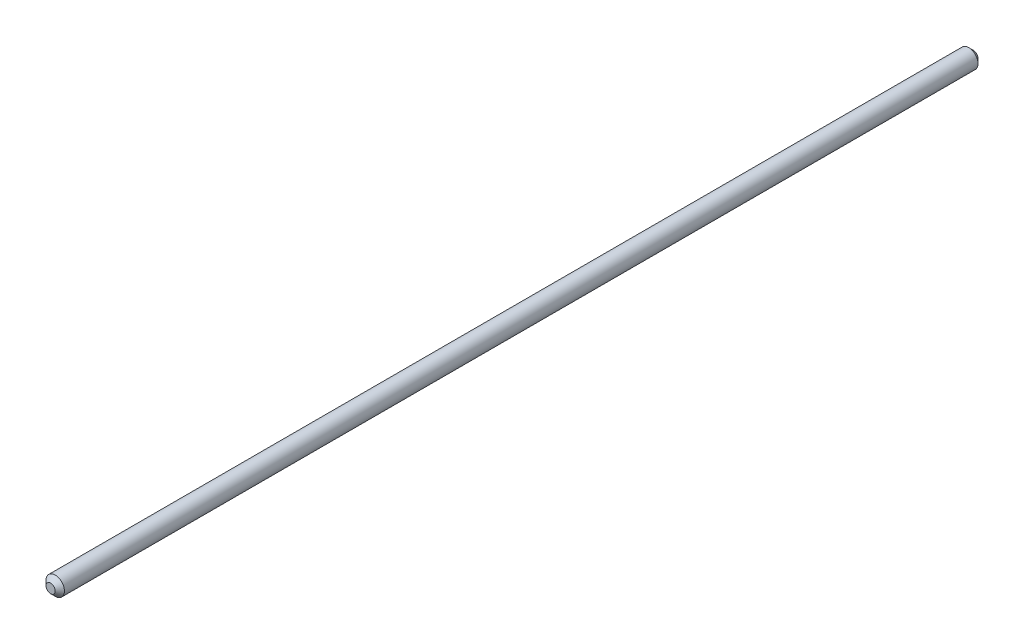
ISO-10303-21;
HEADER;
FILE_DESCRIPTION(('STEP AP214'),'2;1');
FILE_NAME('part.step','',(''),(''),'','','');
FILE_SCHEMA(('AUTOMOTIVE_DESIGN { 1 0 10303 214 1 1 1 1 }'));
ENDSEC;
DATA;
#1=APPLICATION_CONTEXT('core data for automotive mechanical design processes');
#2=APPLICATION_PROTOCOL_DEFINITION('international standard','automotive_design',2000,#1);
#3=PRODUCT_CONTEXT('',#1,'mechanical');
#4=PRODUCT('Part','Part','',(#3));
#5=PRODUCT_RELATED_PRODUCT_CATEGORY('part','',(#4));
#6=PRODUCT_DEFINITION_FORMATION('','',#4);
#7=PRODUCT_DEFINITION_CONTEXT('part definition',#1,'design');
#8=PRODUCT_DEFINITION('design','',#6,#7);
#9=PRODUCT_DEFINITION_SHAPE('','',#8);
#10=(LENGTH_UNIT() NAMED_UNIT(*) SI_UNIT(.MILLI.,.METRE.));
#11=(NAMED_UNIT(*) PLANE_ANGLE_UNIT() SI_UNIT($,.RADIAN.));
#12=(NAMED_UNIT(*) SI_UNIT($,.STERADIAN.) SOLID_ANGLE_UNIT());
#13=UNCERTAINTY_MEASURE_WITH_UNIT(LENGTH_MEASURE(1.E-05),#10,'distance_accuracy_value','');
#14=(GEOMETRIC_REPRESENTATION_CONTEXT(3) GLOBAL_UNCERTAINTY_ASSIGNED_CONTEXT((#13)) GLOBAL_UNIT_ASSIGNED_CONTEXT((#10,
#11,#12)) REPRESENTATION_CONTEXT('',''));
#15=CARTESIAN_POINT('',(0.,0.,0.));
#16=DIRECTION('',(0.,0.,1.));
#17=DIRECTION('',(1.,0.,0.));
#18=AXIS2_PLACEMENT_3D('',#15,#16,#17);
#19=CARTESIAN_POINT('',(0.,0.,400.));
#20=DIRECTION('',(0.,0.,-1.));
#21=DIRECTION('',(-1.,0.,0.));
#22=AXIS2_PLACEMENT_3D('',#19,#20,#21);
#23=CYLINDRICAL_SURFACE('',#22,4.);
#24=CARTESIAN_POINT('',(0.,0.,398.));
#25=DIRECTION('',(0.,0.,1.));
#26=DIRECTION('',(1.,0.,0.));
#27=AXIS2_PLACEMENT_3D('',#24,#25,#26);
#28=CIRCLE('',#27,4.);
#29=CARTESIAN_POINT('',(4.,0.,398.));
#30=VERTEX_POINT('',#29);
#31=EDGE_CURVE('E45',#30,#30,#28,.F.);
#32=ORIENTED_EDGE('',*,*,#31,.T.);
#33=EDGE_LOOP('',(#32));
#34=FACE_BOUND('',#33,.T.);
#35=CARTESIAN_POINT('',(0.,0.,2.00000000000006));
#36=DIRECTION('',(0.,0.,1.));
#37=DIRECTION('',(1.,0.,0.));
#38=AXIS2_PLACEMENT_3D('',#35,#36,#37);
#39=CIRCLE('',#38,4.);
#40=CARTESIAN_POINT('',(4.,0.,2.00000000000006));
#41=VERTEX_POINT('',#40);
#42=EDGE_CURVE('E49',#41,#41,#39,.T.);
#43=ORIENTED_EDGE('',*,*,#42,.T.);
#44=EDGE_LOOP('',(#43));
#45=FACE_BOUND('',#44,.T.);
#46=ADVANCED_FACE('F37',(#34,#45),#23,.T.);
#47=CARTESIAN_POINT('',(0.,0.,400.));
#48=DIRECTION('',(0.,0.,1.));
#49=DIRECTION('',(1.,0.,0.));
#50=AXIS2_PLACEMENT_3D('',#47,#48,#49);
#51=PLANE('',#50);
#52=CARTESIAN_POINT('',(0.,0.,400.));
#53=DIRECTION('',(0.,0.,1.));
#54=DIRECTION('',(1.,0.,0.));
#55=AXIS2_PLACEMENT_3D('',#52,#53,#54);
#56=CIRCLE('',#55,2.);
#57=CARTESIAN_POINT('',(2.,0.,400.));
#58=VERTEX_POINT('',#57);
#59=EDGE_CURVE('E53',#58,#58,#56,.T.);
#60=ORIENTED_EDGE('',*,*,#59,.T.);
#61=EDGE_LOOP('',(#60));
#62=FACE_BOUND('',#61,.T.);
#63=ADVANCED_FACE('F59',(#62),#51,.T.);
#64=CARTESIAN_POINT('',(0.,0.,0.));
#65=DIRECTION('',(0.,0.,1.));
#66=DIRECTION('',(1.,0.,0.));
#67=AXIS2_PLACEMENT_3D('',#64,#65,#66);
#68=PLANE('',#67);
#69=CARTESIAN_POINT('',(0.,0.,0.));
#70=DIRECTION('',(0.,0.,1.));
#71=DIRECTION('',(1.,0.,0.));
#72=AXIS2_PLACEMENT_3D('',#69,#70,#71);
#73=CIRCLE('',#72,1.99999999999989);
#74=CARTESIAN_POINT('',(1.99999999999989,0.,0.));
#75=VERTEX_POINT('',#74);
#76=EDGE_CURVE('E10',#75,#75,#73,.F.);
#77=ORIENTED_EDGE('',*,*,#76,.T.);
#78=EDGE_LOOP('',(#77));
#79=FACE_BOUND('',#78,.T.);
#80=ADVANCED_FACE('F63',(#79),#68,.F.);
#81=CARTESIAN_POINT('',(0.,0.,400.));
#82=DIRECTION('',(0.,0.,-1.));
#83=DIRECTION('',(-1.,0.,0.));
#84=AXIS2_PLACEMENT_3D('',#81,#82,#83);
#85=CONICAL_SURFACE('',#84,2.,0.785398163397447);
#86=ORIENTED_EDGE('',*,*,#31,.F.);
#87=EDGE_LOOP('',(#86));
#88=FACE_BOUND('',#87,.T.);
#89=ORIENTED_EDGE('',*,*,#59,.F.);
#90=EDGE_LOOP('',(#89));
#91=FACE_BOUND('',#90,.T.);
#92=ADVANCED_FACE('F61',(#88,#91),#85,.T.);
#93=CARTESIAN_POINT('',(0.,0.,2.00000000000006));
#94=DIRECTION('',(0.,0.,1.));
#95=DIRECTION('',(1.,0.,0.));
#96=AXIS2_PLACEMENT_3D('',#93,#94,#95);
#97=CONICAL_SURFACE('',#96,4.,0.785398163397461);
#98=ORIENTED_EDGE('',*,*,#76,.F.);
#99=EDGE_LOOP('',(#98));
#100=FACE_BOUND('',#99,.T.);
#101=ORIENTED_EDGE('',*,*,#42,.F.);
#102=EDGE_LOOP('',(#101));
#103=FACE_BOUND('',#102,.T.);
#104=ADVANCED_FACE('F40',(#100,#103),#97,.T.);
#105=CLOSED_SHELL('',(#46,#63,#80,#92,#104));
#106=MANIFOLD_SOLID_BREP('B2',#105);
#107=ADVANCED_BREP_SHAPE_REPRESENTATION('',(#18,#106),#14);
#108=SHAPE_DEFINITION_REPRESENTATION(#9,#107);
ENDSEC;
END-ISO-10303-21;
